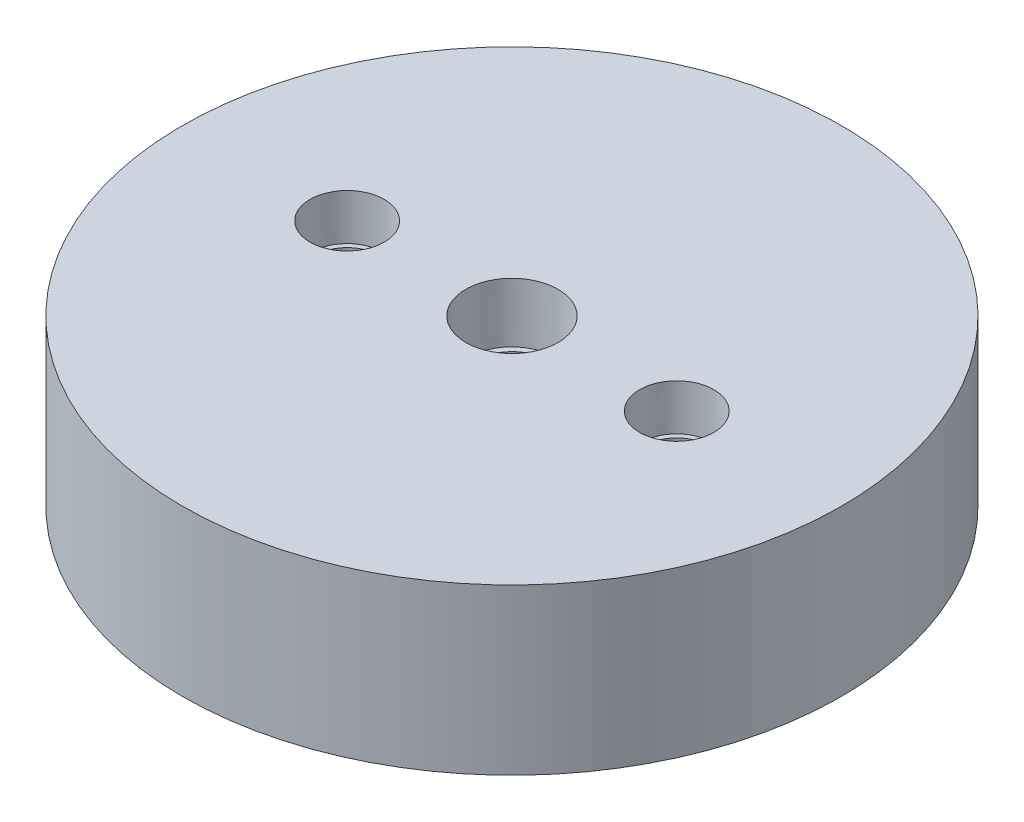
ISO-10303-21;
HEADER;
FILE_DESCRIPTION(('STEP AP214'),'2;1');
FILE_NAME('part.step','',(''),(''),'','','');
FILE_SCHEMA(('AUTOMOTIVE_DESIGN { 1 0 10303 214 1 1 1 1 }'));
ENDSEC;
DATA;
#1=APPLICATION_CONTEXT('core data for automotive mechanical design processes');
#2=APPLICATION_PROTOCOL_DEFINITION('international standard','automotive_design',2000,#1);
#3=PRODUCT_CONTEXT('',#1,'mechanical');
#4=PRODUCT('Part','Part','',(#3));
#5=PRODUCT_RELATED_PRODUCT_CATEGORY('part','',(#4));
#6=PRODUCT_DEFINITION_FORMATION('','',#4);
#7=PRODUCT_DEFINITION_CONTEXT('part definition',#1,'design');
#8=PRODUCT_DEFINITION('design','',#6,#7);
#9=PRODUCT_DEFINITION_SHAPE('','',#8);
#10=(LENGTH_UNIT() NAMED_UNIT(*) SI_UNIT(.MILLI.,.METRE.));
#11=(NAMED_UNIT(*) PLANE_ANGLE_UNIT() SI_UNIT($,.RADIAN.));
#12=(NAMED_UNIT(*) SI_UNIT($,.STERADIAN.) SOLID_ANGLE_UNIT());
#13=UNCERTAINTY_MEASURE_WITH_UNIT(LENGTH_MEASURE(1.E-05),#10,'distance_accuracy_value','');
#14=(GEOMETRIC_REPRESENTATION_CONTEXT(3) GLOBAL_UNCERTAINTY_ASSIGNED_CONTEXT((#13)) GLOBAL_UNIT_ASSIGNED_CONTEXT((#10,
#11,#12)) REPRESENTATION_CONTEXT('',''));
#15=CARTESIAN_POINT('',(0.,0.,0.));
#16=DIRECTION('',(0.,0.,1.));
#17=DIRECTION('',(1.,0.,0.));
#18=AXIS2_PLACEMENT_3D('',#15,#16,#17);
#19=CARTESIAN_POINT('',(0.,-33.02,0.));
#20=DIRECTION('',(0.,-1.,0.));
#21=DIRECTION('',(0.,0.,-1.));
#22=AXIS2_PLACEMENT_3D('',#19,#20,#21);
#23=CYLINDRICAL_SURFACE('',#22,28.575);
#24=CARTESIAN_POINT('',(0.,-38.1,0.));
#25=DIRECTION('',(0.,1.,0.));
#26=DIRECTION('',(0.,0.,1.));
#27=AXIS2_PLACEMENT_3D('',#24,#25,#26);
#28=CIRCLE('',#27,28.575);
#29=CARTESIAN_POINT('',(0.,-38.1,28.575));
#30=VERTEX_POINT('',#29);
#31=EDGE_CURVE('E58',#30,#30,#28,.T.);
#32=ORIENTED_EDGE('',*,*,#31,.F.);
#33=EDGE_LOOP('',(#32));
#34=FACE_BOUND('',#33,.T.);
#35=CARTESIAN_POINT('',(0.,-33.02,0.));
#36=DIRECTION('',(0.,1.,0.));
#37=DIRECTION('',(0.,0.,1.));
#38=AXIS2_PLACEMENT_3D('',#35,#36,#37);
#39=CIRCLE('',#38,28.575);
#40=CARTESIAN_POINT('',(0.,-33.02,28.575));
#41=VERTEX_POINT('',#40);
#42=EDGE_CURVE('E48',#41,#41,#39,.T.);
#43=ORIENTED_EDGE('',*,*,#42,.T.);
#44=EDGE_LOOP('',(#43));
#45=FACE_BOUND('',#44,.T.);
#46=ADVANCED_FACE('F39',(#34,#45),#23,.F.);
#47=CARTESIAN_POINT('',(0.,-33.02,0.));
#48=DIRECTION('',(0.,1.,0.));
#49=DIRECTION('',(0.,0.,1.));
#50=AXIS2_PLACEMENT_3D('',#47,#48,#49);
#51=PLANE('',#50);
#52=CARTESIAN_POINT('',(0.,-33.02,0.));
#53=DIRECTION('',(0.,1.,0.));
#54=DIRECTION('',(0.,0.,1.));
#55=AXIS2_PLACEMENT_3D('',#52,#53,#54);
#56=CIRCLE('',#55,22.225);
#57=CARTESIAN_POINT('',(0.,-33.02,22.225));
#58=VERTEX_POINT('',#57);
#59=EDGE_CURVE('E107',#58,#58,#56,.T.);
#60=ORIENTED_EDGE('',*,*,#59,.T.);
#61=EDGE_LOOP('',(#60));
#62=FACE_BOUND('',#61,.T.);
#63=ORIENTED_EDGE('',*,*,#42,.F.);
#64=EDGE_LOOP('',(#63));
#65=FACE_BOUND('',#64,.T.);
#66=ADVANCED_FACE('F114',(#62,#65),#51,.F.);
#67=CARTESIAN_POINT('',(0.,-28.55722,0.));
#68=DIRECTION('',(0.,-1.,0.));
#69=DIRECTION('',(0.,0.,-1.));
#70=AXIS2_PLACEMENT_3D('',#67,#68,#69);
#71=CYLINDRICAL_SURFACE('',#70,22.225);
#72=CARTESIAN_POINT('',(0.,-28.55722,0.));
#73=DIRECTION('',(0.,1.,0.));
#74=DIRECTION('',(0.,0.,1.));
#75=AXIS2_PLACEMENT_3D('',#72,#73,#74);
#76=CIRCLE('',#75,22.225);
#77=CARTESIAN_POINT('',(0.,-28.55722,22.225));
#78=VERTEX_POINT('',#77);
#79=EDGE_CURVE('E54',#78,#78,#76,.T.);
#80=ORIENTED_EDGE('',*,*,#79,.T.);
#81=EDGE_LOOP('',(#80));
#82=FACE_BOUND('',#81,.T.);
#83=ORIENTED_EDGE('',*,*,#59,.F.);
#84=EDGE_LOOP('',(#83));
#85=FACE_BOUND('',#84,.T.);
#86=ADVANCED_FACE('F117',(#82,#85),#71,.F.);
#87=CARTESIAN_POINT('',(0.,-28.55722,0.));
#88=DIRECTION('',(0.,1.,0.));
#89=DIRECTION('',(0.,0.,1.));
#90=AXIS2_PLACEMENT_3D('',#87,#88,#89);
#91=PLANE('',#90);
#92=CARTESIAN_POINT('',(0.,-28.55722,0.));
#93=DIRECTION('',(0.,1.,0.));
#94=DIRECTION('',(0.,0.,1.));
#95=AXIS2_PLACEMENT_3D('',#92,#93,#94);
#96=CIRCLE('',#95,8.9281);
#97=CARTESIAN_POINT('',(0.,-28.55722,8.9281));
#98=VERTEX_POINT('',#97);
#99=EDGE_CURVE('E64',#98,#98,#96,.T.);
#100=ORIENTED_EDGE('',*,*,#99,.T.);
#101=EDGE_LOOP('',(#100));
#102=FACE_BOUND('',#101,.T.);
#103=ORIENTED_EDGE('',*,*,#79,.F.);
#104=EDGE_LOOP('',(#103));
#105=FACE_BOUND('',#104,.T.);
#106=ADVANCED_FACE('F119',(#102,#105),#91,.F.);
#107=CARTESIAN_POINT('',(0.,-38.1,0.));
#108=DIRECTION('',(0.,-1.,0.));
#109=DIRECTION('',(0.,0.,-1.));
#110=AXIS2_PLACEMENT_3D('',#107,#108,#109);
#111=CYLINDRICAL_SURFACE('',#110,60.96);
#112=CARTESIAN_POINT('',(0.,-38.1,0.));
#113=DIRECTION('',(0.,1.,0.));
#114=DIRECTION('',(0.,0.,1.));
#115=AXIS2_PLACEMENT_3D('',#112,#113,#114);
#116=CIRCLE('',#115,60.96);
#117=CARTESIAN_POINT('',(0.,-38.1,60.96));
#118=VERTEX_POINT('',#117);
#119=EDGE_CURVE('E63',#118,#118,#116,.T.);
#120=ORIENTED_EDGE('',*,*,#119,.T.);
#121=EDGE_LOOP('',(#120));
#122=FACE_BOUND('',#121,.T.);
#123=CARTESIAN_POINT('',(0.,-50.8,0.));
#124=DIRECTION('',(0.,1.,0.));
#125=DIRECTION('',(0.,0.,1.));
#126=AXIS2_PLACEMENT_3D('',#123,#124,#125);
#127=CIRCLE('',#126,60.96);
#128=CARTESIAN_POINT('',(0.,-50.8,60.96));
#129=VERTEX_POINT('',#128);
#130=EDGE_CURVE('E67',#129,#129,#127,.T.);
#131=ORIENTED_EDGE('',*,*,#130,.F.);
#132=EDGE_LOOP('',(#131));
#133=FACE_BOUND('',#132,.T.);
#134=ADVANCED_FACE('F126',(#122,#133),#111,.F.);
#135=CARTESIAN_POINT('',(0.,-38.1,0.));
#136=DIRECTION('',(0.,1.,0.));
#137=DIRECTION('',(0.,0.,1.));
#138=AXIS2_PLACEMENT_3D('',#135,#136,#137);
#139=PLANE('',#138);
#140=CARTESIAN_POINT('',(-38.1,-38.1,0.));
#141=DIRECTION('',(0.,1.,0.));
#142=DIRECTION('',(0.,0.,1.));
#143=AXIS2_PLACEMENT_3D('',#140,#141,#142);
#144=CIRCLE('',#143,7.1374);
#145=CARTESIAN_POINT('',(-38.1,-38.1,7.1374));
#146=VERTEX_POINT('',#145);
#147=EDGE_CURVE('E43',#146,#146,#144,.T.);
#148=ORIENTED_EDGE('',*,*,#147,.T.);
#149=EDGE_LOOP('',(#148));
#150=FACE_BOUND('',#149,.T.);
#151=CARTESIAN_POINT('',(38.1,-38.1,0.));
#152=DIRECTION('',(0.,1.,0.));
#153=DIRECTION('',(0.,0.,1.));
#154=AXIS2_PLACEMENT_3D('',#151,#152,#153);
#155=CIRCLE('',#154,7.1374);
#156=CARTESIAN_POINT('',(38.1,-38.1,7.1374));
#157=VERTEX_POINT('',#156);
#158=EDGE_CURVE('E69',#157,#157,#155,.T.);
#159=ORIENTED_EDGE('',*,*,#158,.T.);
#160=EDGE_LOOP('',(#159));
#161=FACE_BOUND('',#160,.T.);
#162=ORIENTED_EDGE('',*,*,#31,.T.);
#163=EDGE_LOOP('',(#162));
#164=FACE_BOUND('',#163,.T.);
#165=ORIENTED_EDGE('',*,*,#119,.F.);
#166=EDGE_LOOP('',(#165));
#167=FACE_BOUND('',#166,.T.);
#168=ADVANCED_FACE('F153',(#150,#161,#164,#167),#139,.F.);
#169=CARTESIAN_POINT('',(0.,-12.7,0.));
#170=DIRECTION('',(0.,1.,0.));
#171=DIRECTION('',(0.,0.,1.));
#172=AXIS2_PLACEMENT_3D('',#169,#170,#171);
#173=PLANE('',#172);
#174=CARTESIAN_POINT('',(-38.1,-12.7,0.));
#175=DIRECTION('',(0.,1.,0.));
#176=DIRECTION('',(0.,0.,1.));
#177=AXIS2_PLACEMENT_3D('',#174,#175,#176);
#178=CIRCLE('',#177,8.5750146);
#179=CARTESIAN_POINT('',(-38.1,-12.7,8.5750146));
#180=VERTEX_POINT('',#179);
#181=EDGE_CURVE('E169',#180,#180,#178,.T.);
#182=ORIENTED_EDGE('',*,*,#181,.F.);
#183=EDGE_LOOP('',(#182));
#184=FACE_BOUND('',#183,.T.);
#185=CARTESIAN_POINT('',(38.1,-12.7,0.));
#186=DIRECTION('',(0.,1.,0.));
#187=DIRECTION('',(0.,0.,1.));
#188=AXIS2_PLACEMENT_3D('',#185,#186,#187);
#189=CIRCLE('',#188,8.5750146);
#190=CARTESIAN_POINT('',(38.1,-12.7,8.5750146));
#191=VERTEX_POINT('',#190);
#192=EDGE_CURVE('E88',#191,#191,#189,.T.);
#193=ORIENTED_EDGE('',*,*,#192,.F.);
#194=EDGE_LOOP('',(#193));
#195=FACE_BOUND('',#194,.T.);
#196=CARTESIAN_POINT('',(0.,-12.7,0.));
#197=DIRECTION('',(0.,1.,0.));
#198=DIRECTION('',(0.,0.,1.));
#199=AXIS2_PLACEMENT_3D('',#196,#197,#198);
#200=CIRCLE('',#199,10.6647361);
#201=CARTESIAN_POINT('',(0.,-12.7,10.6647361));
#202=VERTEX_POINT('',#201);
#203=EDGE_CURVE('E72',#202,#202,#200,.T.);
#204=ORIENTED_EDGE('',*,*,#203,.F.);
#205=EDGE_LOOP('',(#204));
#206=FACE_BOUND('',#205,.T.);
#207=CARTESIAN_POINT('',(0.,-12.7,0.));
#208=DIRECTION('',(0.,1.,0.));
#209=DIRECTION('',(0.,0.,1.));
#210=AXIS2_PLACEMENT_3D('',#207,#208,#209);
#211=CIRCLE('',#210,76.2);
#212=CARTESIAN_POINT('',(0.,-12.7,76.2));
#213=VERTEX_POINT('',#212);
#214=EDGE_CURVE('E62',#213,#213,#211,.T.);
#215=ORIENTED_EDGE('',*,*,#214,.T.);
#216=EDGE_LOOP('',(#215));
#217=FACE_BOUND('',#216,.T.);
#218=ADVANCED_FACE('F148',(#184,#195,#206,#217),#173,.T.);
#219=CARTESIAN_POINT('',(0.,-50.8,0.));
#220=DIRECTION('',(0.,1.,0.));
#221=DIRECTION('',(0.,0.,1.));
#222=AXIS2_PLACEMENT_3D('',#219,#220,#221);
#223=CYLINDRICAL_SURFACE('',#222,76.2);
#224=CARTESIAN_POINT('',(0.,-50.8,0.));
#225=DIRECTION('',(0.,1.,0.));
#226=DIRECTION('',(0.,0.,1.));
#227=AXIS2_PLACEMENT_3D('',#224,#225,#226);
#228=CIRCLE('',#227,76.2);
#229=CARTESIAN_POINT('',(0.,-50.8,76.2));
#230=VERTEX_POINT('',#229);
#231=EDGE_CURVE('E10',#230,#230,#228,.T.);
#232=ORIENTED_EDGE('',*,*,#231,.T.);
#233=EDGE_LOOP('',(#232));
#234=FACE_BOUND('',#233,.T.);
#235=ORIENTED_EDGE('',*,*,#214,.F.);
#236=EDGE_LOOP('',(#235));
#237=FACE_BOUND('',#236,.T.);
#238=ADVANCED_FACE('F41',(#234,#237),#223,.T.);
#239=CARTESIAN_POINT('',(0.,-50.8,0.));
#240=DIRECTION('',(0.,1.,0.));
#241=DIRECTION('',(0.,0.,1.));
#242=AXIS2_PLACEMENT_3D('',#239,#240,#241);
#243=PLANE('',#242);
#244=ORIENTED_EDGE('',*,*,#130,.T.);
#245=EDGE_LOOP('',(#244));
#246=FACE_BOUND('',#245,.T.);
#247=ORIENTED_EDGE('',*,*,#231,.F.);
#248=EDGE_LOOP('',(#247));
#249=FACE_BOUND('',#248,.T.);
#250=ADVANCED_FACE('F137',(#246,#249),#243,.F.);
#251=CARTESIAN_POINT('',(0.,-12.7,0.));
#252=DIRECTION('',(0.,1.,0.));
#253=DIRECTION('',(0.,0.,1.));
#254=AXIS2_PLACEMENT_3D('',#251,#252,#253);
#255=CYLINDRICAL_SURFACE('',#254,8.9281);
#256=CARTESIAN_POINT('',(0.,-26.162,0.));
#257=DIRECTION('',(0.,1.,0.));
#258=DIRECTION('',(0.,0.,1.));
#259=AXIS2_PLACEMENT_3D('',#256,#257,#258);
#260=CIRCLE('',#259,8.9281);
#261=CARTESIAN_POINT('',(0.,-26.162,8.9281));
#262=VERTEX_POINT('',#261);
#263=EDGE_CURVE('E68',#262,#262,#260,.T.);
#264=ORIENTED_EDGE('',*,*,#263,.T.);
#265=EDGE_LOOP('',(#264));
#266=FACE_BOUND('',#265,.T.);
#267=ORIENTED_EDGE('',*,*,#99,.F.);
#268=EDGE_LOOP('',(#267));
#269=FACE_BOUND('',#268,.T.);
#270=ADVANCED_FACE('F139',(#266,#269),#255,.F.);
#271=CARTESIAN_POINT('',(8.92810000000001,-26.162,0.));
#272=DIRECTION('',(0.,-1.,0.));
#273=DIRECTION('',(0.,0.,-1.));
#274=AXIS2_PLACEMENT_3D('',#271,#272,#273);
#275=PLANE('',#274);
#276=ORIENTED_EDGE('',*,*,#263,.F.);
#277=EDGE_LOOP('',(#276));
#278=FACE_BOUND('',#277,.T.);
#279=CARTESIAN_POINT('',(0.,-26.162,0.));
#280=DIRECTION('',(0.,1.,0.));
#281=DIRECTION('',(0.,0.,1.));
#282=AXIS2_PLACEMENT_3D('',#279,#280,#281);
#283=CIRCLE('',#282,10.2616657920863);
#284=CARTESIAN_POINT('',(0.,-26.162,10.2616657920863));
#285=VERTEX_POINT('',#284);
#286=EDGE_CURVE('E79',#285,#285,#283,.T.);
#287=ORIENTED_EDGE('',*,*,#286,.T.);
#288=EDGE_LOOP('',(#287));
#289=FACE_BOUND('',#288,.T.);
#290=ADVANCED_FACE('F145',(#278,#289),#275,.F.);
#291=CARTESIAN_POINT('',(0.,-12.7,0.));
#292=DIRECTION('',(0.,1.,0.));
#293=DIRECTION('',(0.,0.,1.));
#294=AXIS2_PLACEMENT_3D('',#291,#292,#293);
#295=CONICAL_SURFACE('',#294,10.6647361,0.0299323966717032);
#296=ORIENTED_EDGE('',*,*,#286,.F.);
#297=EDGE_LOOP('',(#296));
#298=FACE_BOUND('',#297,.T.);
#299=ORIENTED_EDGE('',*,*,#203,.T.);
#300=EDGE_LOOP('',(#299));
#301=FACE_BOUND('',#300,.T.);
#302=ADVANCED_FACE('F178',(#298,#301),#295,.F.);
#303=CARTESIAN_POINT('',(38.1,-12.7,0.));
#304=DIRECTION('',(0.,1.,0.));
#305=DIRECTION('',(0.,0.,1.));
#306=AXIS2_PLACEMENT_3D('',#303,#304,#305);
#307=CYLINDRICAL_SURFACE('',#306,7.1374);
#308=CARTESIAN_POINT('',(38.1,-23.114,0.));
#309=DIRECTION('',(0.,1.,0.));
#310=DIRECTION('',(0.,0.,1.));
#311=AXIS2_PLACEMENT_3D('',#308,#309,#310);
#312=CIRCLE('',#311,7.1374);
#313=CARTESIAN_POINT('',(38.1,-23.114,7.1374));
#314=VERTEX_POINT('',#313);
#315=EDGE_CURVE('E73',#314,#314,#312,.T.);
#316=ORIENTED_EDGE('',*,*,#315,.T.);
#317=EDGE_LOOP('',(#316));
#318=FACE_BOUND('',#317,.T.);
#319=ORIENTED_EDGE('',*,*,#158,.F.);
#320=EDGE_LOOP('',(#319));
#321=FACE_BOUND('',#320,.T.);
#322=ADVANCED_FACE('F180',(#318,#321),#307,.F.);
#323=CARTESIAN_POINT('',(45.2374,-23.114,0.));
#324=DIRECTION('',(0.,-1.,0.));
#325=DIRECTION('',(0.,0.,-1.));
#326=AXIS2_PLACEMENT_3D('',#323,#324,#325);
#327=PLANE('',#326);
#328=ORIENTED_EDGE('',*,*,#315,.F.);
#329=EDGE_LOOP('',(#328));
#330=FACE_BOUND('',#329,.T.);
#331=CARTESIAN_POINT('',(38.1,-23.114,0.));
#332=DIRECTION('',(0.,1.,0.));
#333=DIRECTION('',(0.,0.,1.));
#334=AXIS2_PLACEMENT_3D('',#331,#332,#333);
#335=CIRCLE('',#334,8.26320549387809);
#336=CARTESIAN_POINT('',(38.1,-23.114,8.26320549387809));
#337=VERTEX_POINT('',#336);
#338=EDGE_CURVE('E82',#337,#337,#335,.T.);
#339=ORIENTED_EDGE('',*,*,#338,.T.);
#340=EDGE_LOOP('',(#339));
#341=FACE_BOUND('',#340,.T.);
#342=ADVANCED_FACE('F187',(#330,#341),#327,.F.);
#343=CARTESIAN_POINT('',(38.1,-12.7,0.));
#344=DIRECTION('',(0.,1.,0.));
#345=DIRECTION('',(0.,0.,1.));
#346=AXIS2_PLACEMENT_3D('',#343,#344,#345);
#347=CONICAL_SURFACE('',#346,8.5750146,0.0299323966717022);
#348=ORIENTED_EDGE('',*,*,#338,.F.);
#349=EDGE_LOOP('',(#348));
#350=FACE_BOUND('',#349,.T.);
#351=ORIENTED_EDGE('',*,*,#192,.T.);
#352=EDGE_LOOP('',(#351));
#353=FACE_BOUND('',#352,.T.);
#354=ADVANCED_FACE('F195',(#350,#353),#347,.F.);
#355=CARTESIAN_POINT('',(-38.1,-12.7,0.));
#356=DIRECTION('',(0.,1.,0.));
#357=DIRECTION('',(0.,0.,1.));
#358=AXIS2_PLACEMENT_3D('',#355,#356,#357);
#359=CYLINDRICAL_SURFACE('',#358,7.1374);
#360=CARTESIAN_POINT('',(-38.1,-23.114,0.));
#361=DIRECTION('',(0.,1.,0.));
#362=DIRECTION('',(0.,0.,1.));
#363=AXIS2_PLACEMENT_3D('',#360,#361,#362);
#364=CIRCLE('',#363,7.1374);
#365=CARTESIAN_POINT('',(-38.1,-23.114,7.1374));
#366=VERTEX_POINT('',#365);
#367=EDGE_CURVE('E220',#366,#366,#364,.T.);
#368=ORIENTED_EDGE('',*,*,#367,.T.);
#369=EDGE_LOOP('',(#368));
#370=FACE_BOUND('',#369,.T.);
#371=ORIENTED_EDGE('',*,*,#147,.F.);
#372=EDGE_LOOP('',(#371));
#373=FACE_BOUND('',#372,.T.);
#374=ADVANCED_FACE('F199',(#370,#373),#359,.F.);
#375=CARTESIAN_POINT('',(-30.9626,-23.114,0.));
#376=DIRECTION('',(0.,-1.,0.));
#377=DIRECTION('',(0.,0.,-1.));
#378=AXIS2_PLACEMENT_3D('',#375,#376,#377);
#379=PLANE('',#378);
#380=ORIENTED_EDGE('',*,*,#367,.F.);
#381=EDGE_LOOP('',(#380));
#382=FACE_BOUND('',#381,.T.);
#383=CARTESIAN_POINT('',(-38.1,-23.114,0.));
#384=DIRECTION('',(0.,1.,0.));
#385=DIRECTION('',(0.,0.,1.));
#386=AXIS2_PLACEMENT_3D('',#383,#384,#385);
#387=CIRCLE('',#386,8.26320549387809);
#388=CARTESIAN_POINT('',(-38.1,-23.114,8.26320549387809));
#389=VERTEX_POINT('',#388);
#390=EDGE_CURVE('E216',#389,#389,#387,.T.);
#391=ORIENTED_EDGE('',*,*,#390,.T.);
#392=EDGE_LOOP('',(#391));
#393=FACE_BOUND('',#392,.T.);
#394=ADVANCED_FACE('F203',(#382,#393),#379,.F.);
#395=CARTESIAN_POINT('',(-38.1,-12.7,0.));
#396=DIRECTION('',(0.,1.,0.));
#397=DIRECTION('',(0.,0.,1.));
#398=AXIS2_PLACEMENT_3D('',#395,#396,#397);
#399=CONICAL_SURFACE('',#398,8.5750146,0.0299323966717026);
#400=ORIENTED_EDGE('',*,*,#390,.F.);
#401=EDGE_LOOP('',(#400));
#402=FACE_BOUND('',#401,.T.);
#403=ORIENTED_EDGE('',*,*,#181,.T.);
#404=EDGE_LOOP('',(#403));
#405=FACE_BOUND('',#404,.T.);
#406=ADVANCED_FACE('F207',(#402,#405),#399,.F.);
#407=CLOSED_SHELL('',(#46,#66,#86,#106,#134,#168,#218,#238,#250,#270,#290,#302,#322,#342,#354,
#374,#394,#406));
#408=MANIFOLD_SOLID_BREP('B2',#407);
#409=ADVANCED_BREP_SHAPE_REPRESENTATION('',(#18,#408),#14);
#410=SHAPE_DEFINITION_REPRESENTATION(#9,#409);
ENDSEC;
END-ISO-10303-21;
